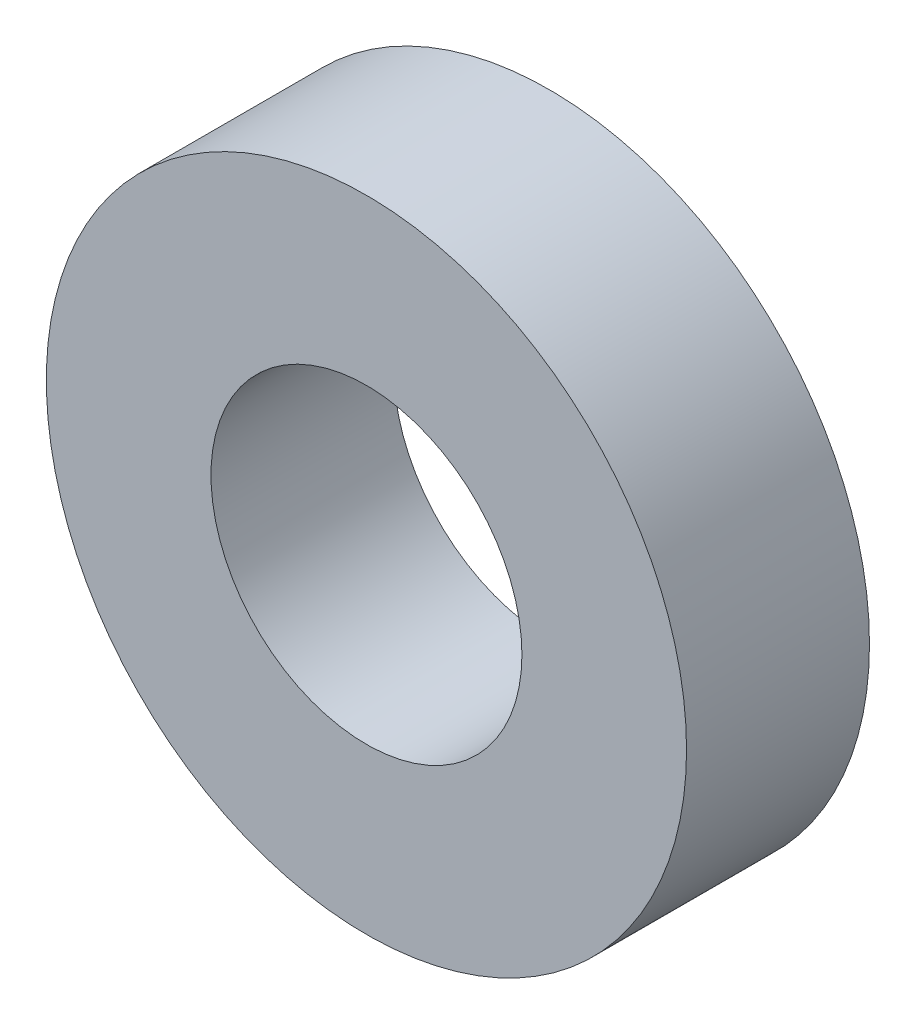
ISO-10303-21;
HEADER;
FILE_DESCRIPTION(('STEP AP214'),'2;1');
FILE_NAME('part.step','',(''),(''),'','','');
FILE_SCHEMA(('AUTOMOTIVE_DESIGN { 1 0 10303 214 1 1 1 1 }'));
ENDSEC;
DATA;
#1=APPLICATION_CONTEXT('core data for automotive mechanical design processes');
#2=APPLICATION_PROTOCOL_DEFINITION('international standard','automotive_design',2000,#1);
#3=PRODUCT_CONTEXT('',#1,'mechanical');
#4=PRODUCT('Part','Part','',(#3));
#5=PRODUCT_RELATED_PRODUCT_CATEGORY('part','',(#4));
#6=PRODUCT_DEFINITION_FORMATION('','',#4);
#7=PRODUCT_DEFINITION_CONTEXT('part definition',#1,'design');
#8=PRODUCT_DEFINITION('design','',#6,#7);
#9=PRODUCT_DEFINITION_SHAPE('','',#8);
#10=(LENGTH_UNIT() NAMED_UNIT(*) SI_UNIT(.MILLI.,.METRE.));
#11=(NAMED_UNIT(*) PLANE_ANGLE_UNIT() SI_UNIT($,.RADIAN.));
#12=(NAMED_UNIT(*) SI_UNIT($,.STERADIAN.) SOLID_ANGLE_UNIT());
#13=UNCERTAINTY_MEASURE_WITH_UNIT(LENGTH_MEASURE(1.E-05),#10,'distance_accuracy_value','');
#14=(GEOMETRIC_REPRESENTATION_CONTEXT(3) GLOBAL_UNCERTAINTY_ASSIGNED_CONTEXT((#13)) GLOBAL_UNIT_ASSIGNED_CONTEXT((#10,
#11,#12)) REPRESENTATION_CONTEXT('',''));
#15=CARTESIAN_POINT('',(0.,0.,0.));
#16=DIRECTION('',(0.,0.,1.));
#17=DIRECTION('',(1.,0.,0.));
#18=AXIS2_PLACEMENT_3D('',#15,#16,#17);
#19=CARTESIAN_POINT('',(0.,0.,-37.));
#20=DIRECTION('',(0.,0.,1.));
#21=DIRECTION('',(1.,0.,0.));
#22=AXIS2_PLACEMENT_3D('',#19,#20,#21);
#23=PLANE('',#22);
#24=CARTESIAN_POINT('',(0.,0.,-37.));
#25=DIRECTION('',(0.,0.,1.));
#26=DIRECTION('',(1.,0.,0.));
#27=AXIS2_PLACEMENT_3D('',#24,#25,#26);
#28=CIRCLE('',#27,17.5);
#29=CARTESIAN_POINT('',(17.5,0.,-37.));
#30=VERTEX_POINT('',#29);
#31=EDGE_CURVE('E10',#30,#30,#28,.T.);
#32=ORIENTED_EDGE('',*,*,#31,.T.);
#33=EDGE_LOOP('',(#32));
#34=FACE_BOUND('',#33,.T.);
#35=CARTESIAN_POINT('',(0.,0.,-37.));
#36=DIRECTION('',(0.,0.,1.));
#37=DIRECTION('',(1.,0.,0.));
#38=AXIS2_PLACEMENT_3D('',#35,#36,#37);
#39=CIRCLE('',#38,8.5);
#40=CARTESIAN_POINT('',(8.5,0.,-37.));
#41=VERTEX_POINT('',#40);
#42=EDGE_CURVE('E50',#41,#41,#39,.T.);
#43=ORIENTED_EDGE('',*,*,#42,.F.);
#44=EDGE_LOOP('',(#43));
#45=FACE_BOUND('',#44,.T.);
#46=ADVANCED_FACE('F36',(#34,#45),#23,.T.);
#47=CARTESIAN_POINT('',(0.,0.,-47.));
#48=DIRECTION('',(0.,0.,1.));
#49=DIRECTION('',(1.,0.,0.));
#50=AXIS2_PLACEMENT_3D('',#47,#48,#49);
#51=PLANE('',#50);
#52=CARTESIAN_POINT('',(0.,0.,-47.));
#53=DIRECTION('',(0.,0.,1.));
#54=DIRECTION('',(1.,0.,0.));
#55=AXIS2_PLACEMENT_3D('',#52,#53,#54);
#56=CIRCLE('',#55,17.5);
#57=CARTESIAN_POINT('',(17.5,0.,-47.));
#58=VERTEX_POINT('',#57);
#59=EDGE_CURVE('E40',#58,#58,#56,.T.);
#60=ORIENTED_EDGE('',*,*,#59,.F.);
#61=EDGE_LOOP('',(#60));
#62=FACE_BOUND('',#61,.T.);
#63=CARTESIAN_POINT('',(0.,0.,-47.));
#64=DIRECTION('',(0.,0.,1.));
#65=DIRECTION('',(1.,0.,0.));
#66=AXIS2_PLACEMENT_3D('',#63,#64,#65);
#67=CIRCLE('',#66,8.5);
#68=CARTESIAN_POINT('',(8.5,0.,-47.));
#69=VERTEX_POINT('',#68);
#70=EDGE_CURVE('E52',#69,#69,#67,.T.);
#71=ORIENTED_EDGE('',*,*,#70,.T.);
#72=EDGE_LOOP('',(#71));
#73=FACE_BOUND('',#72,.T.);
#74=ADVANCED_FACE('F63',(#62,#73),#51,.F.);
#75=CARTESIAN_POINT('',(0.,0.,-37.));
#76=DIRECTION('',(0.,0.,-1.));
#77=DIRECTION('',(-1.,0.,0.));
#78=AXIS2_PLACEMENT_3D('',#75,#76,#77);
#79=CYLINDRICAL_SURFACE('',#78,17.5);
#80=ORIENTED_EDGE('',*,*,#31,.F.);
#81=EDGE_LOOP('',(#80));
#82=FACE_BOUND('',#81,.T.);
#83=ORIENTED_EDGE('',*,*,#59,.T.);
#84=EDGE_LOOP('',(#83));
#85=FACE_BOUND('',#84,.T.);
#86=ADVANCED_FACE('F38',(#82,#85),#79,.T.);
#87=CARTESIAN_POINT('',(0.,0.,-37.));
#88=DIRECTION('',(0.,0.,-1.));
#89=DIRECTION('',(-1.,0.,0.));
#90=AXIS2_PLACEMENT_3D('',#87,#88,#89);
#91=CYLINDRICAL_SURFACE('',#90,8.5);
#92=ORIENTED_EDGE('',*,*,#42,.T.);
#93=EDGE_LOOP('',(#92));
#94=FACE_BOUND('',#93,.T.);
#95=ORIENTED_EDGE('',*,*,#70,.F.);
#96=EDGE_LOOP('',(#95));
#97=FACE_BOUND('',#96,.T.);
#98=ADVANCED_FACE('F59',(#94,#97),#91,.F.);
#99=CLOSED_SHELL('',(#46,#74,#86,#98));
#100=MANIFOLD_SOLID_BREP('B2',#99);
#101=ADVANCED_BREP_SHAPE_REPRESENTATION('',(#18,#100),#14);
#102=SHAPE_DEFINITION_REPRESENTATION(#9,#101);
ENDSEC;
END-ISO-10303-21;
